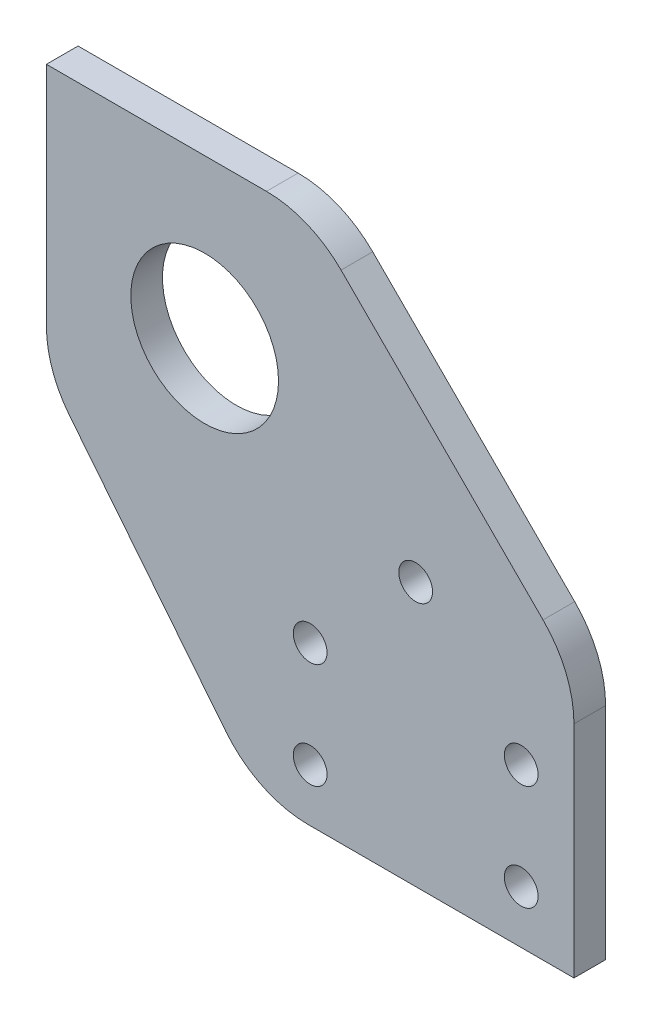
ISO-10303-21;
HEADER;
FILE_DESCRIPTION(('STEP AP214'),'2;1');
FILE_NAME('part.step','',(''),(''),'','','');
FILE_SCHEMA(('AUTOMOTIVE_DESIGN { 1 0 10303 214 1 1 1 1 }'));
ENDSEC;
DATA;
#1=APPLICATION_CONTEXT('core data for automotive mechanical design processes');
#2=APPLICATION_PROTOCOL_DEFINITION('international standard','automotive_design',2000,#1);
#3=PRODUCT_CONTEXT('',#1,'mechanical');
#4=PRODUCT('Part','Part','',(#3));
#5=PRODUCT_RELATED_PRODUCT_CATEGORY('part','',(#4));
#6=PRODUCT_DEFINITION_FORMATION('','',#4);
#7=PRODUCT_DEFINITION_CONTEXT('part definition',#1,'design');
#8=PRODUCT_DEFINITION('design','',#6,#7);
#9=PRODUCT_DEFINITION_SHAPE('','',#8);
#10=(LENGTH_UNIT() NAMED_UNIT(*) SI_UNIT(.MILLI.,.METRE.));
#11=(NAMED_UNIT(*) PLANE_ANGLE_UNIT() SI_UNIT($,.RADIAN.));
#12=(NAMED_UNIT(*) SI_UNIT($,.STERADIAN.) SOLID_ANGLE_UNIT());
#13=UNCERTAINTY_MEASURE_WITH_UNIT(LENGTH_MEASURE(1.E-05),#10,'distance_accuracy_value','');
#14=(GEOMETRIC_REPRESENTATION_CONTEXT(3) GLOBAL_UNCERTAINTY_ASSIGNED_CONTEXT((#13)) GLOBAL_UNIT_ASSIGNED_CONTEXT((#10,
#11,#12)) REPRESENTATION_CONTEXT('',''));
#15=CARTESIAN_POINT('',(0.,0.,0.));
#16=DIRECTION('',(0.,0.,1.));
#17=DIRECTION('',(1.,0.,0.));
#18=AXIS2_PLACEMENT_3D('',#15,#16,#17);
#19=CARTESIAN_POINT('',(0.,0.,3.));
#20=DIRECTION('',(1.,0.,0.));
#21=DIRECTION('',(0.,1.,0.));
#22=AXIS2_PLACEMENT_3D('',#19,#20,#21);
#23=PLANE('',#22);
#24=DIRECTION('',(0.,-1.,0.));
#25=VECTOR('',#24,1.);
#26=CARTESIAN_POINT('',(0.,0.,0.));
#27=LINE('',#26,#25);
#28=CARTESIAN_POINT('',(0.,0.,0.));
#29=VERTEX_POINT('',#28);
#30=CARTESIAN_POINT('',(0.,-21.4921894064179,0.));
#31=VERTEX_POINT('',#30);
#32=EDGE_CURVE('E158',#29,#31,#27,.T.);
#33=ORIENTED_EDGE('',*,*,#32,.T.);
#34=DIRECTION('',(0.,0.,1.));
#35=VECTOR('',#34,1.);
#36=CARTESIAN_POINT('',(0.,-21.4921894064179,3.));
#37=LINE('',#36,#35);
#38=CARTESIAN_POINT('',(0.,-21.4921894064179,3.));
#39=VERTEX_POINT('',#38);
#40=EDGE_CURVE('E205',#31,#39,#37,.T.);
#41=ORIENTED_EDGE('',*,*,#40,.T.);
#42=DIRECTION('',(0.,-1.,0.));
#43=VECTOR('',#42,1.);
#44=CARTESIAN_POINT('',(0.,0.,3.));
#45=LINE('',#44,#43);
#46=CARTESIAN_POINT('',(0.,0.,3.));
#47=VERTEX_POINT('',#46);
#48=EDGE_CURVE('E135',#47,#39,#45,.T.);
#49=ORIENTED_EDGE('',*,*,#48,.F.);
#50=DIRECTION('',(0.,0.,-1.));
#51=VECTOR('',#50,1.);
#52=CARTESIAN_POINT('',(0.,0.,3.));
#53=LINE('',#52,#51);
#54=EDGE_CURVE('E145',#47,#29,#53,.T.);
#55=ORIENTED_EDGE('',*,*,#54,.T.);
#56=EDGE_LOOP('',(#33,#41,#49,#55));
#57=FACE_BOUND('',#56,.T.);
#58=ADVANCED_FACE('F45',(#57),#23,.F.);
#59=CARTESIAN_POINT('',(0.,-50.,3.));
#60=DIRECTION('',(0.,1.,0.));
#61=DIRECTION('',(0.,0.,1.));
#62=AXIS2_PLACEMENT_3D('',#59,#60,#61);
#63=PLANE('',#62);
#64=DIRECTION('',(1.,0.,0.));
#65=VECTOR('',#64,1.);
#66=CARTESIAN_POINT('',(0.,-50.,3.));
#67=LINE('',#66,#65);
#68=CARTESIAN_POINT('',(24.8062484748657,-50.,3.));
#69=VERTEX_POINT('',#68);
#70=CARTESIAN_POINT('',(50.,-50.,3.));
#71=VERTEX_POINT('',#70);
#72=EDGE_CURVE('E124',#69,#71,#67,.T.);
#73=ORIENTED_EDGE('',*,*,#72,.F.);
#74=DIRECTION('',(0.,0.,1.));
#75=VECTOR('',#74,1.);
#76=CARTESIAN_POINT('',(24.8062484748657,-50.,3.));
#77=LINE('',#76,#75);
#78=CARTESIAN_POINT('',(24.8062484748657,-50.,0.));
#79=VERTEX_POINT('',#78);
#80=EDGE_CURVE('E191',#69,#79,#77,.F.);
#81=ORIENTED_EDGE('',*,*,#80,.T.);
#82=DIRECTION('',(1.,0.,0.));
#83=VECTOR('',#82,1.);
#84=CARTESIAN_POINT('',(0.,-50.,0.));
#85=LINE('',#84,#83);
#86=CARTESIAN_POINT('',(50.,-50.,0.));
#87=VERTEX_POINT('',#86);
#88=EDGE_CURVE('E141',#79,#87,#85,.T.);
#89=ORIENTED_EDGE('',*,*,#88,.T.);
#90=DIRECTION('',(0.,0.,-1.));
#91=VECTOR('',#90,1.);
#92=CARTESIAN_POINT('',(50.,-50.,3.));
#93=LINE('',#92,#91);
#94=EDGE_CURVE('E138',#71,#87,#93,.T.);
#95=ORIENTED_EDGE('',*,*,#94,.F.);
#96=EDGE_LOOP('',(#73,#81,#89,#95));
#97=FACE_BOUND('',#96,.T.);
#98=ADVANCED_FACE('F139',(#97),#63,.F.);
#99=CARTESIAN_POINT('',(50.,0.,3.));
#100=DIRECTION('',(-1.,0.,0.));
#101=DIRECTION('',(0.,-1.,0.));
#102=AXIS2_PLACEMENT_3D('',#99,#100,#101);
#103=PLANE('',#102);
#104=DIRECTION('',(0.,1.,0.));
#105=VECTOR('',#104,1.);
#106=CARTESIAN_POINT('',(50.,0.,0.));
#107=LINE('',#106,#105);
#108=CARTESIAN_POINT('',(50.,-29.142135623731,0.));
#109=VERTEX_POINT('',#108);
#110=EDGE_CURVE('E165',#87,#109,#107,.T.);
#111=ORIENTED_EDGE('',*,*,#110,.T.);
#112=DIRECTION('',(0.,0.,1.));
#113=VECTOR('',#112,1.);
#114=CARTESIAN_POINT('',(50.,-29.142135623731,3.));
#115=LINE('',#114,#113);
#116=CARTESIAN_POINT('',(50.,-29.142135623731,3.));
#117=VERTEX_POINT('',#116);
#118=EDGE_CURVE('E150',#109,#117,#115,.T.);
#119=ORIENTED_EDGE('',*,*,#118,.T.);
#120=DIRECTION('',(0.,1.,0.));
#121=VECTOR('',#120,1.);
#122=CARTESIAN_POINT('',(50.,0.,3.));
#123=LINE('',#122,#121);
#124=EDGE_CURVE('E130',#71,#117,#123,.T.);
#125=ORIENTED_EDGE('',*,*,#124,.F.);
#126=ORIENTED_EDGE('',*,*,#94,.T.);
#127=EDGE_LOOP('',(#111,#119,#125,#126));
#128=FACE_BOUND('',#127,.T.);
#129=ADVANCED_FACE('F148',(#128),#103,.F.);
#130=CARTESIAN_POINT('',(0.,0.,3.));
#131=DIRECTION('',(0.,-1.,0.));
#132=DIRECTION('',(0.,0.,-1.));
#133=AXIS2_PLACEMENT_3D('',#130,#131,#132);
#134=PLANE('',#133);
#135=DIRECTION('',(-1.,0.,0.));
#136=VECTOR('',#135,1.);
#137=CARTESIAN_POINT('',(0.,0.,3.));
#138=LINE('',#137,#136);
#139=CARTESIAN_POINT('',(20.857864376269,0.,3.));
#140=VERTEX_POINT('',#139);
#141=EDGE_CURVE('E152',#140,#47,#138,.T.);
#142=ORIENTED_EDGE('',*,*,#141,.F.);
#143=DIRECTION('',(0.,0.,1.));
#144=VECTOR('',#143,1.);
#145=CARTESIAN_POINT('',(20.857864376269,0.,3.));
#146=LINE('',#145,#144);
#147=CARTESIAN_POINT('',(20.857864376269,0.,0.));
#148=VERTEX_POINT('',#147);
#149=EDGE_CURVE('E11',#140,#148,#146,.F.);
#150=ORIENTED_EDGE('',*,*,#149,.T.);
#151=DIRECTION('',(-1.,0.,0.));
#152=VECTOR('',#151,1.);
#153=CARTESIAN_POINT('',(0.,0.,0.));
#154=LINE('',#153,#152);
#155=EDGE_CURVE('E168',#148,#29,#154,.T.);
#156=ORIENTED_EDGE('',*,*,#155,.T.);
#157=ORIENTED_EDGE('',*,*,#54,.F.);
#158=EDGE_LOOP('',(#142,#150,#156,#157));
#159=FACE_BOUND('',#158,.T.);
#160=ADVANCED_FACE('F319',(#159),#134,.F.);
#161=CARTESIAN_POINT('',(0.,0.,3.));
#162=DIRECTION('',(0.,0.,1.));
#163=DIRECTION('',(1.,0.,0.));
#164=AXIS2_PLACEMENT_3D('',#161,#162,#163);
#165=PLANE('',#164);
#166=DIRECTION('',(-0.624695047554424,0.78086880944303,0.));
#167=VECTOR('',#166,1.);
#168=CARTESIAN_POINT('',(0.,-25.,3.));
#169=LINE('',#168,#167);
#170=CARTESIAN_POINT('',(16.9975603804354,-46.2469504755442,3.));
#171=VERTEX_POINT('',#170);
#172=CARTESIAN_POINT('',(2.1913119055697,-27.7391398819621,3.));
#173=VERTEX_POINT('',#172);
#174=EDGE_CURVE('E224',#171,#173,#169,.T.);
#175=ORIENTED_EDGE('',*,*,#174,.F.);
#176=CARTESIAN_POINT('',(24.8062484748657,-40.,3.));
#177=DIRECTION('',(0.,0.,1.));
#178=DIRECTION('',(1.,0.,0.));
#179=AXIS2_PLACEMENT_3D('',#176,#177,#178);
#180=CIRCLE('',#179,10.);
#181=EDGE_CURVE('E131',#171,#69,#180,.T.);
#182=ORIENTED_EDGE('',*,*,#181,.T.);
#183=ORIENTED_EDGE('',*,*,#72,.T.);
#184=ORIENTED_EDGE('',*,*,#124,.T.);
#185=CARTESIAN_POINT('',(40.,-29.142135623731,3.));
#186=DIRECTION('',(0.,0.,1.));
#187=DIRECTION('',(1.,0.,0.));
#188=AXIS2_PLACEMENT_3D('',#185,#186,#187);
#189=CIRCLE('',#188,10.);
#190=CARTESIAN_POINT('',(47.0710678118655,-22.0710678118655,3.));
#191=VERTEX_POINT('',#190);
#192=EDGE_CURVE('E183',#117,#191,#189,.T.);
#193=ORIENTED_EDGE('',*,*,#192,.T.);
#194=DIRECTION('',(0.707106781186547,-0.707106781186547,0.));
#195=VECTOR('',#194,1.);
#196=CARTESIAN_POINT('',(50.,-25.,3.));
#197=LINE('',#196,#195);
#198=CARTESIAN_POINT('',(27.9289321881345,-2.92893218813453,3.));
#199=VERTEX_POINT('',#198);
#200=EDGE_CURVE('E218',#199,#191,#197,.T.);
#201=ORIENTED_EDGE('',*,*,#200,.F.);
#202=CARTESIAN_POINT('',(20.857864376269,-10.,3.));
#203=DIRECTION('',(0.,0.,1.));
#204=DIRECTION('',(1.,0.,0.));
#205=AXIS2_PLACEMENT_3D('',#202,#203,#204);
#206=CIRCLE('',#205,10.);
#207=EDGE_CURVE('E180',#199,#140,#206,.T.);
#208=ORIENTED_EDGE('',*,*,#207,.T.);
#209=ORIENTED_EDGE('',*,*,#141,.T.);
#210=ORIENTED_EDGE('',*,*,#48,.T.);
#211=CARTESIAN_POINT('',(10.,-21.4921894064179,3.));
#212=DIRECTION('',(0.,0.,1.));
#213=DIRECTION('',(1.,0.,0.));
#214=AXIS2_PLACEMENT_3D('',#211,#212,#213);
#215=CIRCLE('',#214,10.);
#216=EDGE_CURVE('E186',#39,#173,#215,.T.);
#217=ORIENTED_EDGE('',*,*,#216,.T.);
#218=EDGE_LOOP('',(#175,#182,#183,#184,#193,#201,#208,#209,#210,#217));
#219=FACE_BOUND('',#218,.T.);
#220=CARTESIAN_POINT('',(15.,-15.,3.));
#221=DIRECTION('',(0.,0.,1.));
#222=DIRECTION('',(1.,0.,0.));
#223=AXIS2_PLACEMENT_3D('',#220,#221,#222);
#224=CIRCLE('',#223,7.);
#225=CARTESIAN_POINT('',(22.,-15.,3.));
#226=VERTEX_POINT('',#225);
#227=EDGE_CURVE('E237',#226,#226,#224,.T.);
#228=ORIENTED_EDGE('',*,*,#227,.F.);
#229=EDGE_LOOP('',(#228));
#230=FACE_BOUND('',#229,.T.);
#231=CARTESIAN_POINT('',(45.,-45.,3.));
#232=DIRECTION('',(0.,0.,1.));
#233=DIRECTION('',(1.,0.,0.));
#234=AXIS2_PLACEMENT_3D('',#231,#232,#233);
#235=CIRCLE('',#234,1.6);
#236=CARTESIAN_POINT('',(46.6,-45.,3.));
#237=VERTEX_POINT('',#236);
#238=EDGE_CURVE('E241',#237,#237,#235,.T.);
#239=ORIENTED_EDGE('',*,*,#238,.F.);
#240=EDGE_LOOP('',(#239));
#241=FACE_BOUND('',#240,.T.);
#242=CARTESIAN_POINT('',(45.,-35.,3.));
#243=DIRECTION('',(0.,0.,1.));
#244=DIRECTION('',(-1.,0.,0.));
#245=AXIS2_PLACEMENT_3D('',#242,#243,#244);
#246=CIRCLE('',#245,1.6);
#247=CARTESIAN_POINT('',(43.4,-35.,3.));
#248=VERTEX_POINT('',#247);
#249=EDGE_CURVE('E249',#248,#248,#246,.T.);
#250=ORIENTED_EDGE('',*,*,#249,.F.);
#251=EDGE_LOOP('',(#250));
#252=FACE_BOUND('',#251,.T.);
#253=CARTESIAN_POINT('',(25.,-35.,3.));
#254=DIRECTION('',(0.,0.,1.));
#255=DIRECTION('',(1.,0.,0.));
#256=AXIS2_PLACEMENT_3D('',#253,#254,#255);
#257=CIRCLE('',#256,1.6);
#258=CARTESIAN_POINT('',(26.6,-35.,3.));
#259=VERTEX_POINT('',#258);
#260=EDGE_CURVE('E257',#259,#259,#257,.T.);
#261=ORIENTED_EDGE('',*,*,#260,.F.);
#262=EDGE_LOOP('',(#261));
#263=FACE_BOUND('',#262,.T.);
#264=CARTESIAN_POINT('',(25.,-45.,3.));
#265=DIRECTION('',(0.,0.,1.));
#266=DIRECTION('',(-1.,0.,0.));
#267=AXIS2_PLACEMENT_3D('',#264,#265,#266);
#268=CIRCLE('',#267,1.6);
#269=CARTESIAN_POINT('',(23.4,-45.,3.));
#270=VERTEX_POINT('',#269);
#271=EDGE_CURVE('E265',#270,#270,#268,.T.);
#272=ORIENTED_EDGE('',*,*,#271,.F.);
#273=EDGE_LOOP('',(#272));
#274=FACE_BOUND('',#273,.T.);
#275=CARTESIAN_POINT('',(35.,-25.,3.));
#276=DIRECTION('',(0.,0.,1.));
#277=DIRECTION('',(1.,0.,0.));
#278=AXIS2_PLACEMENT_3D('',#275,#276,#277);
#279=CIRCLE('',#278,1.6);
#280=CARTESIAN_POINT('',(36.6,-25.,3.));
#281=VERTEX_POINT('',#280);
#282=EDGE_CURVE('E273',#281,#281,#279,.T.);
#283=ORIENTED_EDGE('',*,*,#282,.F.);
#284=EDGE_LOOP('',(#283));
#285=FACE_BOUND('',#284,.T.);
#286=ADVANCED_FACE('F127',(#219,#230,#241,#252,#263,#274,#285),#165,.T.);
#287=CARTESIAN_POINT('',(0.,0.,0.));
#288=DIRECTION('',(0.,0.,1.));
#289=DIRECTION('',(1.,0.,0.));
#290=AXIS2_PLACEMENT_3D('',#287,#288,#289);
#291=PLANE('',#290);
#292=CARTESIAN_POINT('',(15.,-15.,0.));
#293=DIRECTION('',(0.,0.,1.));
#294=DIRECTION('',(1.,0.,0.));
#295=AXIS2_PLACEMENT_3D('',#292,#293,#294);
#296=CIRCLE('',#295,7.);
#297=CARTESIAN_POINT('',(22.,-15.,0.));
#298=VERTEX_POINT('',#297);
#299=EDGE_CURVE('E162',#298,#298,#296,.T.);
#300=ORIENTED_EDGE('',*,*,#299,.T.);
#301=EDGE_LOOP('',(#300));
#302=FACE_BOUND('',#301,.T.);
#303=CARTESIAN_POINT('',(45.,-45.,0.));
#304=DIRECTION('',(0.,0.,1.));
#305=DIRECTION('',(1.,0.,0.));
#306=AXIS2_PLACEMENT_3D('',#303,#304,#305);
#307=CIRCLE('',#306,1.6);
#308=CARTESIAN_POINT('',(46.6,-45.,0.));
#309=VERTEX_POINT('',#308);
#310=EDGE_CURVE('E245',#309,#309,#307,.T.);
#311=ORIENTED_EDGE('',*,*,#310,.T.);
#312=EDGE_LOOP('',(#311));
#313=FACE_BOUND('',#312,.T.);
#314=CARTESIAN_POINT('',(45.,-35.,0.));
#315=DIRECTION('',(0.,0.,1.));
#316=DIRECTION('',(-1.,0.,0.));
#317=AXIS2_PLACEMENT_3D('',#314,#315,#316);
#318=CIRCLE('',#317,1.6);
#319=CARTESIAN_POINT('',(43.4,-35.,0.));
#320=VERTEX_POINT('',#319);
#321=EDGE_CURVE('E253',#320,#320,#318,.T.);
#322=ORIENTED_EDGE('',*,*,#321,.T.);
#323=EDGE_LOOP('',(#322));
#324=FACE_BOUND('',#323,.T.);
#325=CARTESIAN_POINT('',(25.,-35.,0.));
#326=DIRECTION('',(0.,0.,1.));
#327=DIRECTION('',(1.,0.,0.));
#328=AXIS2_PLACEMENT_3D('',#325,#326,#327);
#329=CIRCLE('',#328,1.6);
#330=CARTESIAN_POINT('',(26.6,-35.,0.));
#331=VERTEX_POINT('',#330);
#332=EDGE_CURVE('E261',#331,#331,#329,.T.);
#333=ORIENTED_EDGE('',*,*,#332,.T.);
#334=EDGE_LOOP('',(#333));
#335=FACE_BOUND('',#334,.T.);
#336=CARTESIAN_POINT('',(25.,-45.,0.));
#337=DIRECTION('',(0.,0.,1.));
#338=DIRECTION('',(-1.,0.,0.));
#339=AXIS2_PLACEMENT_3D('',#336,#337,#338);
#340=CIRCLE('',#339,1.6);
#341=CARTESIAN_POINT('',(23.4,-45.,0.));
#342=VERTEX_POINT('',#341);
#343=EDGE_CURVE('E269',#342,#342,#340,.T.);
#344=ORIENTED_EDGE('',*,*,#343,.T.);
#345=EDGE_LOOP('',(#344));
#346=FACE_BOUND('',#345,.T.);
#347=CARTESIAN_POINT('',(35.,-25.,0.));
#348=DIRECTION('',(0.,0.,1.));
#349=DIRECTION('',(1.,0.,0.));
#350=AXIS2_PLACEMENT_3D('',#347,#348,#349);
#351=CIRCLE('',#350,1.6);
#352=CARTESIAN_POINT('',(36.6,-25.,0.));
#353=VERTEX_POINT('',#352);
#354=EDGE_CURVE('E277',#353,#353,#351,.T.);
#355=ORIENTED_EDGE('',*,*,#354,.T.);
#356=EDGE_LOOP('',(#355));
#357=FACE_BOUND('',#356,.T.);
#358=ORIENTED_EDGE('',*,*,#88,.F.);
#359=CARTESIAN_POINT('',(24.8062484748657,-40.,0.));
#360=DIRECTION('',(0.,0.,1.));
#361=DIRECTION('',(1.,0.,0.));
#362=AXIS2_PLACEMENT_3D('',#359,#360,#361);
#363=CIRCLE('',#362,10.);
#364=CARTESIAN_POINT('',(16.9975603804354,-46.2469504755442,0.));
#365=VERTEX_POINT('',#364);
#366=EDGE_CURVE('E202',#79,#365,#363,.F.);
#367=ORIENTED_EDGE('',*,*,#366,.T.);
#368=DIRECTION('',(-0.624695047554424,0.78086880944303,0.));
#369=VECTOR('',#368,1.);
#370=CARTESIAN_POINT('',(0.,-25.,0.));
#371=LINE('',#370,#369);
#372=CARTESIAN_POINT('',(2.1913119055697,-27.7391398819621,0.));
#373=VERTEX_POINT('',#372);
#374=EDGE_CURVE('E229',#365,#373,#371,.T.);
#375=ORIENTED_EDGE('',*,*,#374,.T.);
#376=CARTESIAN_POINT('',(10.,-21.4921894064179,0.));
#377=DIRECTION('',(0.,0.,1.));
#378=DIRECTION('',(1.,0.,0.));
#379=AXIS2_PLACEMENT_3D('',#376,#377,#378);
#380=CIRCLE('',#379,10.);
#381=EDGE_CURVE('E199',#373,#31,#380,.F.);
#382=ORIENTED_EDGE('',*,*,#381,.T.);
#383=ORIENTED_EDGE('',*,*,#32,.F.);
#384=ORIENTED_EDGE('',*,*,#155,.F.);
#385=CARTESIAN_POINT('',(20.857864376269,-10.,0.));
#386=DIRECTION('',(0.,0.,1.));
#387=DIRECTION('',(1.,0.,0.));
#388=AXIS2_PLACEMENT_3D('',#385,#386,#387);
#389=CIRCLE('',#388,10.);
#390=CARTESIAN_POINT('',(27.9289321881345,-2.92893218813453,0.));
#391=VERTEX_POINT('',#390);
#392=EDGE_CURVE('E194',#148,#391,#389,.F.);
#393=ORIENTED_EDGE('',*,*,#392,.T.);
#394=DIRECTION('',(0.707106781186547,-0.707106781186547,0.));
#395=VECTOR('',#394,1.);
#396=CARTESIAN_POINT('',(50.,-25.,0.));
#397=LINE('',#396,#395);
#398=CARTESIAN_POINT('',(47.0710678118655,-22.0710678118655,0.));
#399=VERTEX_POINT('',#398);
#400=EDGE_CURVE('E219',#391,#399,#397,.T.);
#401=ORIENTED_EDGE('',*,*,#400,.T.);
#402=CARTESIAN_POINT('',(40.,-29.142135623731,0.));
#403=DIRECTION('',(0.,0.,1.));
#404=DIRECTION('',(1.,0.,0.));
#405=AXIS2_PLACEMENT_3D('',#402,#403,#404);
#406=CIRCLE('',#405,10.);
#407=EDGE_CURVE('E61',#399,#109,#406,.F.);
#408=ORIENTED_EDGE('',*,*,#407,.T.);
#409=ORIENTED_EDGE('',*,*,#110,.F.);
#410=EDGE_LOOP('',(#358,#367,#375,#382,#383,#384,#393,#401,#408,#409));
#411=FACE_BOUND('',#410,.T.);
#412=ADVANCED_FACE('F296',(#302,#313,#324,#335,#346,#357,#411),#291,.F.);
#413=CARTESIAN_POINT('',(35.,-25.,0.));
#414=DIRECTION('',(0.,0.,1.));
#415=DIRECTION('',(1.,0.,0.));
#416=AXIS2_PLACEMENT_3D('',#413,#414,#415);
#417=CYLINDRICAL_SURFACE('',#416,1.6);
#418=ORIENTED_EDGE('',*,*,#354,.F.);
#419=EDGE_LOOP('',(#418));
#420=FACE_BOUND('',#419,.T.);
#421=ORIENTED_EDGE('',*,*,#282,.T.);
#422=EDGE_LOOP('',(#421));
#423=FACE_BOUND('',#422,.T.);
#424=ADVANCED_FACE('F325',(#420,#423),#417,.F.);
#425=CARTESIAN_POINT('',(25.,-45.,0.));
#426=DIRECTION('',(0.,0.,1.));
#427=DIRECTION('',(1.,0.,0.));
#428=AXIS2_PLACEMENT_3D('',#425,#426,#427);
#429=CYLINDRICAL_SURFACE('',#428,1.6);
#430=ORIENTED_EDGE('',*,*,#343,.F.);
#431=EDGE_LOOP('',(#430));
#432=FACE_BOUND('',#431,.T.);
#433=ORIENTED_EDGE('',*,*,#271,.T.);
#434=EDGE_LOOP('',(#433));
#435=FACE_BOUND('',#434,.T.);
#436=ADVANCED_FACE('F331',(#432,#435),#429,.F.);
#437=CARTESIAN_POINT('',(25.,-35.,0.));
#438=DIRECTION('',(0.,0.,1.));
#439=DIRECTION('',(1.,0.,0.));
#440=AXIS2_PLACEMENT_3D('',#437,#438,#439);
#441=CYLINDRICAL_SURFACE('',#440,1.6);
#442=ORIENTED_EDGE('',*,*,#332,.F.);
#443=EDGE_LOOP('',(#442));
#444=FACE_BOUND('',#443,.T.);
#445=ORIENTED_EDGE('',*,*,#260,.T.);
#446=EDGE_LOOP('',(#445));
#447=FACE_BOUND('',#446,.T.);
#448=ADVANCED_FACE('F335',(#444,#447),#441,.F.);
#449=CARTESIAN_POINT('',(45.,-35.,0.));
#450=DIRECTION('',(0.,0.,1.));
#451=DIRECTION('',(1.,0.,0.));
#452=AXIS2_PLACEMENT_3D('',#449,#450,#451);
#453=CYLINDRICAL_SURFACE('',#452,1.6);
#454=ORIENTED_EDGE('',*,*,#321,.F.);
#455=EDGE_LOOP('',(#454));
#456=FACE_BOUND('',#455,.T.);
#457=ORIENTED_EDGE('',*,*,#249,.T.);
#458=EDGE_LOOP('',(#457));
#459=FACE_BOUND('',#458,.T.);
#460=ADVANCED_FACE('F339',(#456,#459),#453,.F.);
#461=CARTESIAN_POINT('',(45.,-45.,0.));
#462=DIRECTION('',(0.,0.,1.));
#463=DIRECTION('',(1.,0.,0.));
#464=AXIS2_PLACEMENT_3D('',#461,#462,#463);
#465=CYLINDRICAL_SURFACE('',#464,1.6);
#466=ORIENTED_EDGE('',*,*,#310,.F.);
#467=EDGE_LOOP('',(#466));
#468=FACE_BOUND('',#467,.T.);
#469=ORIENTED_EDGE('',*,*,#238,.T.);
#470=EDGE_LOOP('',(#469));
#471=FACE_BOUND('',#470,.T.);
#472=ADVANCED_FACE('F343',(#468,#471),#465,.F.);
#473=CARTESIAN_POINT('',(15.,-15.,0.));
#474=DIRECTION('',(0.,0.,1.));
#475=DIRECTION('',(1.,0.,0.));
#476=AXIS2_PLACEMENT_3D('',#473,#474,#475);
#477=CYLINDRICAL_SURFACE('',#476,7.);
#478=ORIENTED_EDGE('',*,*,#299,.F.);
#479=EDGE_LOOP('',(#478));
#480=FACE_BOUND('',#479,.T.);
#481=ORIENTED_EDGE('',*,*,#227,.T.);
#482=EDGE_LOOP('',(#481));
#483=FACE_BOUND('',#482,.T.);
#484=ADVANCED_FACE('F347',(#480,#483),#477,.F.);
#485=CARTESIAN_POINT('',(50.,-25.,0.));
#486=DIRECTION('',(-0.707106781186548,-0.707106781186548,0.));
#487=DIRECTION('',(0.707106781186548,-0.707106781186548,0.));
#488=AXIS2_PLACEMENT_3D('',#485,#486,#487);
#489=PLANE('',#488);
#490=ORIENTED_EDGE('',*,*,#200,.T.);
#491=DIRECTION('',(0.,0.,1.));
#492=VECTOR('',#491,1.);
#493=CARTESIAN_POINT('',(47.0710678118655,-22.0710678118655,0.));
#494=LINE('',#493,#492);
#495=EDGE_CURVE('E54',#191,#399,#494,.F.);
#496=ORIENTED_EDGE('',*,*,#495,.T.);
#497=ORIENTED_EDGE('',*,*,#400,.F.);
#498=DIRECTION('',(0.,0.,1.));
#499=VECTOR('',#498,1.);
#500=CARTESIAN_POINT('',(27.9289321881345,-2.92893218813452,0.));
#501=LINE('',#500,#499);
#502=EDGE_CURVE('E211',#391,#199,#501,.T.);
#503=ORIENTED_EDGE('',*,*,#502,.T.);
#504=EDGE_LOOP('',(#490,#496,#497,#503));
#505=FACE_BOUND('',#504,.T.);
#506=ADVANCED_FACE('F217',(#505),#489,.F.);
#507=CARTESIAN_POINT('',(0.,-25.,0.));
#508=DIRECTION('',(0.78086880944303,0.624695047554424,0.));
#509=DIRECTION('',(-0.624695047554424,0.78086880944303,0.));
#510=AXIS2_PLACEMENT_3D('',#507,#508,#509);
#511=PLANE('',#510);
#512=ORIENTED_EDGE('',*,*,#374,.F.);
#513=DIRECTION('',(0.,0.,1.));
#514=VECTOR('',#513,1.);
#515=CARTESIAN_POINT('',(16.9975603804354,-46.2469504755442,0.));
#516=LINE('',#515,#514);
#517=EDGE_CURVE('E176',#365,#171,#516,.T.);
#518=ORIENTED_EDGE('',*,*,#517,.T.);
#519=ORIENTED_EDGE('',*,*,#174,.T.);
#520=DIRECTION('',(0.,0.,1.));
#521=VECTOR('',#520,1.);
#522=CARTESIAN_POINT('',(2.1913119055697,-27.7391398819621,0.));
#523=LINE('',#522,#521);
#524=EDGE_CURVE('E144',#173,#373,#523,.F.);
#525=ORIENTED_EDGE('',*,*,#524,.T.);
#526=EDGE_LOOP('',(#512,#518,#519,#525));
#527=FACE_BOUND('',#526,.T.);
#528=ADVANCED_FACE('F294',(#527),#511,.F.);
#529=CARTESIAN_POINT('',(24.8062484748657,-40.,0.));
#530=DIRECTION('',(0.,0.,1.));
#531=DIRECTION('',(1.,0.,0.));
#532=AXIS2_PLACEMENT_3D('',#529,#530,#531);
#533=CYLINDRICAL_SURFACE('',#532,10.);
#534=ORIENTED_EDGE('',*,*,#366,.F.);
#535=ORIENTED_EDGE('',*,*,#80,.F.);
#536=ORIENTED_EDGE('',*,*,#181,.F.);
#537=ORIENTED_EDGE('',*,*,#517,.F.);
#538=EDGE_LOOP('',(#534,#535,#536,#537));
#539=FACE_BOUND('',#538,.T.);
#540=ADVANCED_FACE('F300',(#539),#533,.T.);
#541=CARTESIAN_POINT('',(10.,-21.4921894064179,3.));
#542=DIRECTION('',(0.,0.,1.));
#543=DIRECTION('',(1.,0.,0.));
#544=AXIS2_PLACEMENT_3D('',#541,#542,#543);
#545=CYLINDRICAL_SURFACE('',#544,10.);
#546=ORIENTED_EDGE('',*,*,#381,.F.);
#547=ORIENTED_EDGE('',*,*,#524,.F.);
#548=ORIENTED_EDGE('',*,*,#216,.F.);
#549=ORIENTED_EDGE('',*,*,#40,.F.);
#550=EDGE_LOOP('',(#546,#547,#548,#549));
#551=FACE_BOUND('',#550,.T.);
#552=ADVANCED_FACE('F289',(#551),#545,.T.);
#553=CARTESIAN_POINT('',(40.,-29.142135623731,3.));
#554=DIRECTION('',(0.,0.,1.));
#555=DIRECTION('',(1.,0.,0.));
#556=AXIS2_PLACEMENT_3D('',#553,#554,#555);
#557=CYLINDRICAL_SURFACE('',#556,10.);
#558=ORIENTED_EDGE('',*,*,#407,.F.);
#559=ORIENTED_EDGE('',*,*,#495,.F.);
#560=ORIENTED_EDGE('',*,*,#192,.F.);
#561=ORIENTED_EDGE('',*,*,#118,.F.);
#562=EDGE_LOOP('',(#558,#559,#560,#561));
#563=FACE_BOUND('',#562,.T.);
#564=ADVANCED_FACE('F307',(#563),#557,.T.);
#565=CARTESIAN_POINT('',(20.857864376269,-10.,0.));
#566=DIRECTION('',(0.,0.,1.));
#567=DIRECTION('',(1.,0.,0.));
#568=AXIS2_PLACEMENT_3D('',#565,#566,#567);
#569=CYLINDRICAL_SURFACE('',#568,10.);
#570=ORIENTED_EDGE('',*,*,#392,.F.);
#571=ORIENTED_EDGE('',*,*,#149,.F.);
#572=ORIENTED_EDGE('',*,*,#207,.F.);
#573=ORIENTED_EDGE('',*,*,#502,.F.);
#574=EDGE_LOOP('',(#570,#571,#572,#573));
#575=FACE_BOUND('',#574,.T.);
#576=ADVANCED_FACE('F47',(#575),#569,.T.);
#577=CLOSED_SHELL('',(#58,#98,#129,#160,#286,#412,#424,#436,#448,#460,#472,#484,#506,#528,#540,
#552,#564,#576));
#578=MANIFOLD_SOLID_BREP('B2',#577);
#579=ADVANCED_BREP_SHAPE_REPRESENTATION('',(#18,#578),#14);
#580=SHAPE_DEFINITION_REPRESENTATION(#9,#579);
ENDSEC;
END-ISO-10303-21;
